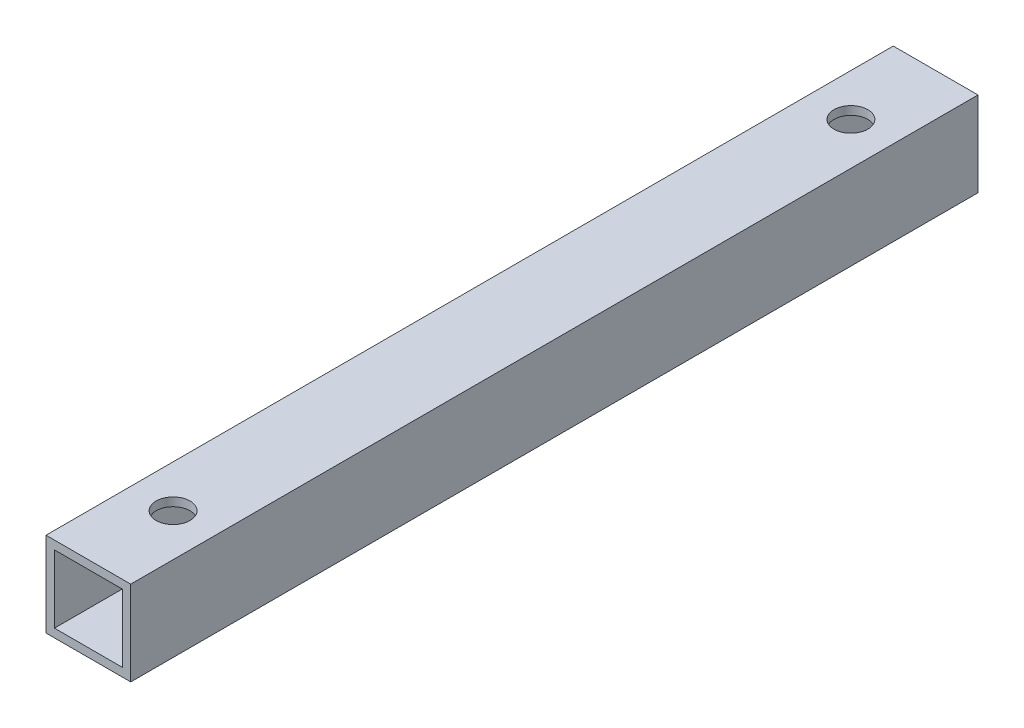
ISO-10303-21;
HEADER;
FILE_DESCRIPTION(('STEP AP214'),'2;1');
FILE_NAME('part.step','',(''),(''),'','','');
FILE_SCHEMA(('AUTOMOTIVE_DESIGN { 1 0 10303 214 1 1 1 1 }'));
ENDSEC;
DATA;
#1=APPLICATION_CONTEXT('core data for automotive mechanical design processes');
#2=APPLICATION_PROTOCOL_DEFINITION('international standard','automotive_design',2000,#1);
#3=PRODUCT_CONTEXT('',#1,'mechanical');
#4=PRODUCT('Part','Part','',(#3));
#5=PRODUCT_RELATED_PRODUCT_CATEGORY('part','',(#4));
#6=PRODUCT_DEFINITION_FORMATION('','',#4);
#7=PRODUCT_DEFINITION_CONTEXT('part definition',#1,'design');
#8=PRODUCT_DEFINITION('design','',#6,#7);
#9=PRODUCT_DEFINITION_SHAPE('','',#8);
#10=(LENGTH_UNIT() NAMED_UNIT(*) SI_UNIT(.MILLI.,.METRE.));
#11=(NAMED_UNIT(*) PLANE_ANGLE_UNIT() SI_UNIT($,.RADIAN.));
#12=(NAMED_UNIT(*) SI_UNIT($,.STERADIAN.) SOLID_ANGLE_UNIT());
#13=UNCERTAINTY_MEASURE_WITH_UNIT(LENGTH_MEASURE(1.E-05),#10,'distance_accuracy_value','');
#14=(GEOMETRIC_REPRESENTATION_CONTEXT(3) GLOBAL_UNCERTAINTY_ASSIGNED_CONTEXT((#13)) GLOBAL_UNIT_ASSIGNED_CONTEXT((#10,
#11,#12)) REPRESENTATION_CONTEXT('',''));
#15=CARTESIAN_POINT('',(0.,0.,0.));
#16=DIRECTION('',(0.,0.,1.));
#17=DIRECTION('',(1.,0.,0.));
#18=AXIS2_PLACEMENT_3D('',#15,#16,#17);
#19=CARTESIAN_POINT('',(0.,0.,100.));
#20=DIRECTION('',(0.,0.,-1.));
#21=DIRECTION('',(-1.,0.,0.));
#22=AXIS2_PLACEMENT_3D('',#19,#20,#21);
#23=PLANE('',#22);
#24=DIRECTION('',(0.,-1.,0.));
#25=VECTOR('',#24,1.);
#26=CARTESIAN_POINT('',(-0.999999999999999,-1.,100.));
#27=LINE('',#26,#25);
#28=CARTESIAN_POINT('',(-0.999999999999999,9.,100.));
#29=VERTEX_POINT('',#28);
#30=CARTESIAN_POINT('',(-0.999999999999999,-1.,100.));
#31=VERTEX_POINT('',#30);
#32=EDGE_CURVE('E140',#29,#31,#27,.T.);
#33=ORIENTED_EDGE('',*,*,#32,.T.);
#34=DIRECTION('',(1.,0.,0.));
#35=VECTOR('',#34,1.);
#36=CARTESIAN_POINT('',(9.,-1.,100.));
#37=LINE('',#36,#35);
#38=CARTESIAN_POINT('',(9.,-1.,100.));
#39=VERTEX_POINT('',#38);
#40=EDGE_CURVE('E143',#31,#39,#37,.T.);
#41=ORIENTED_EDGE('',*,*,#40,.T.);
#42=DIRECTION('',(0.,1.,0.));
#43=VECTOR('',#42,1.);
#44=CARTESIAN_POINT('',(9.,9.,100.));
#45=LINE('',#44,#43);
#46=CARTESIAN_POINT('',(9.,9.,100.));
#47=VERTEX_POINT('',#46);
#48=EDGE_CURVE('E146',#39,#47,#45,.T.);
#49=ORIENTED_EDGE('',*,*,#48,.T.);
#50=DIRECTION('',(-1.,0.,0.));
#51=VECTOR('',#50,1.);
#52=CARTESIAN_POINT('',(-0.999999999999999,9.,100.));
#53=LINE('',#52,#51);
#54=EDGE_CURVE('E148',#47,#29,#53,.T.);
#55=ORIENTED_EDGE('',*,*,#54,.T.);
#56=EDGE_LOOP('',(#33,#41,#49,#55));
#57=FACE_BOUND('',#56,.T.);
#58=DIRECTION('',(1.,0.,0.));
#59=VECTOR('',#58,1.);
#60=CARTESIAN_POINT('',(8.,0.,100.));
#61=LINE('',#60,#59);
#62=CARTESIAN_POINT('',(0.,0.,100.));
#63=VERTEX_POINT('',#62);
#64=CARTESIAN_POINT('',(8.,0.,100.));
#65=VERTEX_POINT('',#64);
#66=EDGE_CURVE('E102',#63,#65,#61,.T.);
#67=ORIENTED_EDGE('',*,*,#66,.F.);
#68=DIRECTION('',(0.,-1.,0.));
#69=VECTOR('',#68,1.);
#70=CARTESIAN_POINT('',(0.,0.,100.));
#71=LINE('',#70,#69);
#72=CARTESIAN_POINT('',(0.,8.,100.));
#73=VERTEX_POINT('',#72);
#74=EDGE_CURVE('E124',#73,#63,#71,.T.);
#75=ORIENTED_EDGE('',*,*,#74,.F.);
#76=DIRECTION('',(-1.,0.,0.));
#77=VECTOR('',#76,1.);
#78=CARTESIAN_POINT('',(0.,8.,100.));
#79=LINE('',#78,#77);
#80=CARTESIAN_POINT('',(8.,8.,100.));
#81=VERTEX_POINT('',#80);
#82=EDGE_CURVE('E122',#81,#73,#79,.T.);
#83=ORIENTED_EDGE('',*,*,#82,.F.);
#84=DIRECTION('',(0.,1.,0.));
#85=VECTOR('',#84,1.);
#86=CARTESIAN_POINT('',(8.,8.,100.));
#87=LINE('',#86,#85);
#88=EDGE_CURVE('E110',#65,#81,#87,.T.);
#89=ORIENTED_EDGE('',*,*,#88,.F.);
#90=EDGE_LOOP('',(#67,#75,#83,#89));
#91=FACE_BOUND('',#90,.T.);
#92=ADVANCED_FACE('F35',(#57,#91),#23,.F.);
#93=CARTESIAN_POINT('',(0.,0.,0.));
#94=DIRECTION('',(0.,0.,-1.));
#95=DIRECTION('',(-1.,0.,0.));
#96=AXIS2_PLACEMENT_3D('',#93,#94,#95);
#97=PLANE('',#96);
#98=DIRECTION('',(1.,0.,0.));
#99=VECTOR('',#98,1.);
#100=CARTESIAN_POINT('',(9.,-1.,0.));
#101=LINE('',#100,#99);
#102=CARTESIAN_POINT('',(-0.999999999999999,-1.,0.));
#103=VERTEX_POINT('',#102);
#104=CARTESIAN_POINT('',(9.,-1.,0.));
#105=VERTEX_POINT('',#104);
#106=EDGE_CURVE('E118',#103,#105,#101,.T.);
#107=ORIENTED_EDGE('',*,*,#106,.F.);
#108=DIRECTION('',(0.,-1.,0.));
#109=VECTOR('',#108,1.);
#110=CARTESIAN_POINT('',(-0.999999999999999,5.89679715302491,0.));
#111=LINE('',#110,#109);
#112=CARTESIAN_POINT('',(-0.999999999999999,9.,0.));
#113=VERTEX_POINT('',#112);
#114=EDGE_CURVE('E144',#113,#103,#111,.T.);
#115=ORIENTED_EDGE('',*,*,#114,.F.);
#116=DIRECTION('',(-1.,0.,0.));
#117=VECTOR('',#116,1.);
#118=CARTESIAN_POINT('',(-0.999999999999999,9.,0.));
#119=LINE('',#118,#117);
#120=CARTESIAN_POINT('',(9.,9.,0.));
#121=VERTEX_POINT('',#120);
#122=EDGE_CURVE('E155',#121,#113,#119,.T.);
#123=ORIENTED_EDGE('',*,*,#122,.F.);
#124=DIRECTION('',(0.,1.,0.));
#125=VECTOR('',#124,1.);
#126=CARTESIAN_POINT('',(9.,9.,0.));
#127=LINE('',#126,#125);
#128=EDGE_CURVE('E153',#105,#121,#127,.T.);
#129=ORIENTED_EDGE('',*,*,#128,.F.);
#130=EDGE_LOOP('',(#107,#115,#123,#129));
#131=FACE_BOUND('',#130,.T.);
#132=DIRECTION('',(0.,-1.,0.));
#133=VECTOR('',#132,1.);
#134=CARTESIAN_POINT('',(0.,0.,0.));
#135=LINE('',#134,#133);
#136=CARTESIAN_POINT('',(0.,8.,0.));
#137=VERTEX_POINT('',#136);
#138=CARTESIAN_POINT('',(0.,0.,0.));
#139=VERTEX_POINT('',#138);
#140=EDGE_CURVE('E111',#137,#139,#135,.T.);
#141=ORIENTED_EDGE('',*,*,#140,.T.);
#142=DIRECTION('',(1.,0.,0.));
#143=VECTOR('',#142,1.);
#144=CARTESIAN_POINT('',(8.,0.,0.));
#145=LINE('',#144,#143);
#146=CARTESIAN_POINT('',(8.,0.,0.));
#147=VERTEX_POINT('',#146);
#148=EDGE_CURVE('E60',#139,#147,#145,.T.);
#149=ORIENTED_EDGE('',*,*,#148,.T.);
#150=DIRECTION('',(0.,1.,0.));
#151=VECTOR('',#150,1.);
#152=CARTESIAN_POINT('',(8.,8.,0.));
#153=LINE('',#152,#151);
#154=CARTESIAN_POINT('',(8.,8.,0.));
#155=VERTEX_POINT('',#154);
#156=EDGE_CURVE('E117',#147,#155,#153,.T.);
#157=ORIENTED_EDGE('',*,*,#156,.T.);
#158=DIRECTION('',(-1.,0.,0.));
#159=VECTOR('',#158,1.);
#160=CARTESIAN_POINT('',(0.,8.,0.));
#161=LINE('',#160,#159);
#162=EDGE_CURVE('E132',#155,#137,#161,.T.);
#163=ORIENTED_EDGE('',*,*,#162,.T.);
#164=EDGE_LOOP('',(#141,#149,#157,#163));
#165=FACE_BOUND('',#164,.T.);
#166=ADVANCED_FACE('F205',(#131,#165),#97,.T.);
#167=CARTESIAN_POINT('',(9.,-1.,100.));
#168=DIRECTION('',(0.,1.,0.));
#169=DIRECTION('',(-1.,0.,0.));
#170=AXIS2_PLACEMENT_3D('',#167,#168,#169);
#171=PLANE('',#170);
#172=CARTESIAN_POINT('',(4.,-1.,90.));
#173=DIRECTION('',(0.,1.,0.));
#174=DIRECTION('',(-1.,0.,0.));
#175=AXIS2_PLACEMENT_3D('',#172,#173,#174);
#176=CIRCLE('',#175,2.);
#177=CARTESIAN_POINT('',(4.,-1.00000000000001,92.));
#178=VERTEX_POINT('',#177);
#179=EDGE_CURVE('E130',#178,#178,#176,.T.);
#180=ORIENTED_EDGE('',*,*,#179,.T.);
#181=EDGE_LOOP('',(#180));
#182=FACE_BOUND('',#181,.T.);
#183=CARTESIAN_POINT('',(4.,-1.,10.));
#184=DIRECTION('',(0.,1.,0.));
#185=DIRECTION('',(-1.,0.,0.));
#186=AXIS2_PLACEMENT_3D('',#183,#184,#185);
#187=CIRCLE('',#186,2.);
#188=CARTESIAN_POINT('',(4.,-1.00000000000001,12.));
#189=VERTEX_POINT('',#188);
#190=EDGE_CURVE('E171',#189,#189,#187,.T.);
#191=ORIENTED_EDGE('',*,*,#190,.T.);
#192=EDGE_LOOP('',(#191));
#193=FACE_BOUND('',#192,.T.);
#194=ORIENTED_EDGE('',*,*,#106,.T.);
#195=DIRECTION('',(0.,0.,-1.));
#196=VECTOR('',#195,1.);
#197=CARTESIAN_POINT('',(9.,-1.,100.));
#198=LINE('',#197,#196);
#199=EDGE_CURVE('E44',#39,#105,#198,.T.);
#200=ORIENTED_EDGE('',*,*,#199,.F.);
#201=ORIENTED_EDGE('',*,*,#40,.F.);
#202=DIRECTION('',(0.,0.,-1.));
#203=VECTOR('',#202,1.);
#204=CARTESIAN_POINT('',(-0.999999999999999,-1.,100.));
#205=LINE('',#204,#203);
#206=EDGE_CURVE('E11',#31,#103,#205,.T.);
#207=ORIENTED_EDGE('',*,*,#206,.T.);
#208=EDGE_LOOP('',(#194,#200,#201,#207));
#209=FACE_BOUND('',#208,.T.);
#210=ADVANCED_FACE('F37',(#182,#193,#209),#171,.F.);
#211=CARTESIAN_POINT('',(9.,9.,100.));
#212=DIRECTION('',(-1.,0.,0.));
#213=DIRECTION('',(0.,-1.,0.));
#214=AXIS2_PLACEMENT_3D('',#211,#212,#213);
#215=PLANE('',#214);
#216=ORIENTED_EDGE('',*,*,#128,.T.);
#217=DIRECTION('',(0.,0.,-1.));
#218=VECTOR('',#217,1.);
#219=CARTESIAN_POINT('',(9.,9.,100.));
#220=LINE('',#219,#218);
#221=EDGE_CURVE('E160',#47,#121,#220,.T.);
#222=ORIENTED_EDGE('',*,*,#221,.F.);
#223=ORIENTED_EDGE('',*,*,#48,.F.);
#224=ORIENTED_EDGE('',*,*,#199,.T.);
#225=EDGE_LOOP('',(#216,#222,#223,#224));
#226=FACE_BOUND('',#225,.T.);
#227=ADVANCED_FACE('F222',(#226),#215,.F.);
#228=CARTESIAN_POINT('',(-0.999999999999999,9.,100.));
#229=DIRECTION('',(0.,-1.,0.));
#230=DIRECTION('',(0.,0.,-1.));
#231=AXIS2_PLACEMENT_3D('',#228,#229,#230);
#232=PLANE('',#231);
#233=CARTESIAN_POINT('',(4.,9.,90.));
#234=DIRECTION('',(0.,1.,0.));
#235=DIRECTION('',(0.,0.,1.));
#236=AXIS2_PLACEMENT_3D('',#233,#234,#235);
#237=CIRCLE('',#236,2.);
#238=CARTESIAN_POINT('',(4.,8.99999999999999,92.));
#239=VERTEX_POINT('',#238);
#240=EDGE_CURVE('E167',#239,#239,#237,.T.);
#241=ORIENTED_EDGE('',*,*,#240,.F.);
#242=EDGE_LOOP('',(#241));
#243=FACE_BOUND('',#242,.T.);
#244=CARTESIAN_POINT('',(4.,9.,10.));
#245=DIRECTION('',(0.,1.,0.));
#246=DIRECTION('',(0.,0.,1.));
#247=AXIS2_PLACEMENT_3D('',#244,#245,#246);
#248=CIRCLE('',#247,2.);
#249=CARTESIAN_POINT('',(4.,8.99999999999999,12.));
#250=VERTEX_POINT('',#249);
#251=EDGE_CURVE('E174',#250,#250,#248,.T.);
#252=ORIENTED_EDGE('',*,*,#251,.F.);
#253=EDGE_LOOP('',(#252));
#254=FACE_BOUND('',#253,.T.);
#255=ORIENTED_EDGE('',*,*,#122,.T.);
#256=DIRECTION('',(0.,0.,-1.));
#257=VECTOR('',#256,1.);
#258=CARTESIAN_POINT('',(-0.999999999999999,9.,100.));
#259=LINE('',#258,#257);
#260=EDGE_CURVE('E151',#29,#113,#259,.T.);
#261=ORIENTED_EDGE('',*,*,#260,.F.);
#262=ORIENTED_EDGE('',*,*,#54,.F.);
#263=ORIENTED_EDGE('',*,*,#221,.T.);
#264=EDGE_LOOP('',(#255,#261,#262,#263));
#265=FACE_BOUND('',#264,.T.);
#266=ADVANCED_FACE('F219',(#243,#254,#265),#232,.F.);
#267=CARTESIAN_POINT('',(-0.999999999999999,5.89679715302491,100.));
#268=DIRECTION('',(1.,0.,0.));
#269=DIRECTION('',(0.,0.,-1.));
#270=AXIS2_PLACEMENT_3D('',#267,#268,#269);
#271=PLANE('',#270);
#272=ORIENTED_EDGE('',*,*,#114,.T.);
#273=ORIENTED_EDGE('',*,*,#206,.F.);
#274=ORIENTED_EDGE('',*,*,#32,.F.);
#275=ORIENTED_EDGE('',*,*,#260,.T.);
#276=EDGE_LOOP('',(#272,#273,#274,#275));
#277=FACE_BOUND('',#276,.T.);
#278=ADVANCED_FACE('F216',(#277),#271,.F.);
#279=CARTESIAN_POINT('',(8.,0.,100.));
#280=DIRECTION('',(0.,1.,0.));
#281=DIRECTION('',(0.,0.,1.));
#282=AXIS2_PLACEMENT_3D('',#279,#280,#281);
#283=PLANE('',#282);
#284=CARTESIAN_POINT('',(4.,0.,90.));
#285=DIRECTION('',(0.,1.,0.));
#286=DIRECTION('',(0.,0.,1.));
#287=AXIS2_PLACEMENT_3D('',#284,#285,#286);
#288=CIRCLE('',#287,2.);
#289=CARTESIAN_POINT('',(4.,0.,92.));
#290=VERTEX_POINT('',#289);
#291=EDGE_CURVE('E183',#290,#290,#288,.T.);
#292=ORIENTED_EDGE('',*,*,#291,.F.);
#293=EDGE_LOOP('',(#292));
#294=FACE_BOUND('',#293,.T.);
#295=CARTESIAN_POINT('',(4.,0.,10.));
#296=DIRECTION('',(0.,1.,0.));
#297=DIRECTION('',(0.,0.,1.));
#298=AXIS2_PLACEMENT_3D('',#295,#296,#297);
#299=CIRCLE('',#298,2.);
#300=CARTESIAN_POINT('',(4.,0.,12.));
#301=VERTEX_POINT('',#300);
#302=EDGE_CURVE('E166',#301,#301,#299,.T.);
#303=ORIENTED_EDGE('',*,*,#302,.F.);
#304=EDGE_LOOP('',(#303));
#305=FACE_BOUND('',#304,.T.);
#306=ORIENTED_EDGE('',*,*,#148,.F.);
#307=DIRECTION('',(0.,0.,-1.));
#308=VECTOR('',#307,1.);
#309=CARTESIAN_POINT('',(0.,0.,100.));
#310=LINE('',#309,#308);
#311=EDGE_CURVE('E106',#63,#139,#310,.T.);
#312=ORIENTED_EDGE('',*,*,#311,.F.);
#313=ORIENTED_EDGE('',*,*,#66,.T.);
#314=DIRECTION('',(0.,0.,-1.));
#315=VECTOR('',#314,1.);
#316=CARTESIAN_POINT('',(8.,0.,100.));
#317=LINE('',#316,#315);
#318=EDGE_CURVE('E105',#65,#147,#317,.T.);
#319=ORIENTED_EDGE('',*,*,#318,.T.);
#320=EDGE_LOOP('',(#306,#312,#313,#319));
#321=FACE_BOUND('',#320,.T.);
#322=ADVANCED_FACE('F104',(#294,#305,#321),#283,.T.);
#323=CARTESIAN_POINT('',(8.,8.,100.));
#324=DIRECTION('',(-1.,0.,0.));
#325=DIRECTION('',(0.,0.,1.));
#326=AXIS2_PLACEMENT_3D('',#323,#324,#325);
#327=PLANE('',#326);
#328=ORIENTED_EDGE('',*,*,#156,.F.);
#329=ORIENTED_EDGE('',*,*,#318,.F.);
#330=ORIENTED_EDGE('',*,*,#88,.T.);
#331=DIRECTION('',(0.,0.,-1.));
#332=VECTOR('',#331,1.);
#333=CARTESIAN_POINT('',(8.,8.,100.));
#334=LINE('',#333,#332);
#335=EDGE_CURVE('E119',#81,#155,#334,.T.);
#336=ORIENTED_EDGE('',*,*,#335,.T.);
#337=EDGE_LOOP('',(#328,#329,#330,#336));
#338=FACE_BOUND('',#337,.T.);
#339=ADVANCED_FACE('F114',(#338),#327,.T.);
#340=CARTESIAN_POINT('',(0.,8.,100.));
#341=DIRECTION('',(0.,-1.,0.));
#342=DIRECTION('',(0.,0.,-1.));
#343=AXIS2_PLACEMENT_3D('',#340,#341,#342);
#344=PLANE('',#343);
#345=CARTESIAN_POINT('',(4.,8.00000000000001,90.));
#346=DIRECTION('',(0.,-1.,0.));
#347=DIRECTION('',(0.,0.,-1.));
#348=AXIS2_PLACEMENT_3D('',#345,#346,#347);
#349=CIRCLE('',#348,2.);
#350=CARTESIAN_POINT('',(4.,8.00000000000002,92.));
#351=VERTEX_POINT('',#350);
#352=EDGE_CURVE('E39',#351,#351,#349,.T.);
#353=ORIENTED_EDGE('',*,*,#352,.F.);
#354=EDGE_LOOP('',(#353));
#355=FACE_BOUND('',#354,.T.);
#356=CARTESIAN_POINT('',(4.,8.00000000000001,10.));
#357=DIRECTION('',(0.,-1.,0.));
#358=DIRECTION('',(0.,0.,-1.));
#359=AXIS2_PLACEMENT_3D('',#356,#357,#358);
#360=CIRCLE('',#359,2.);
#361=CARTESIAN_POINT('',(4.,8.00000000000002,12.));
#362=VERTEX_POINT('',#361);
#363=EDGE_CURVE('E164',#362,#362,#360,.T.);
#364=ORIENTED_EDGE('',*,*,#363,.F.);
#365=EDGE_LOOP('',(#364));
#366=FACE_BOUND('',#365,.T.);
#367=ORIENTED_EDGE('',*,*,#162,.F.);
#368=ORIENTED_EDGE('',*,*,#335,.F.);
#369=ORIENTED_EDGE('',*,*,#82,.T.);
#370=DIRECTION('',(0.,0.,-1.));
#371=VECTOR('',#370,1.);
#372=CARTESIAN_POINT('',(0.,8.,100.));
#373=LINE('',#372,#371);
#374=EDGE_CURVE('E52',#73,#137,#373,.T.);
#375=ORIENTED_EDGE('',*,*,#374,.T.);
#376=EDGE_LOOP('',(#367,#368,#369,#375));
#377=FACE_BOUND('',#376,.T.);
#378=ADVANCED_FACE('F245',(#355,#366,#377),#344,.T.);
#379=CARTESIAN_POINT('',(0.,0.,100.));
#380=DIRECTION('',(1.,0.,0.));
#381=DIRECTION('',(0.,0.,-1.));
#382=AXIS2_PLACEMENT_3D('',#379,#380,#381);
#383=PLANE('',#382);
#384=ORIENTED_EDGE('',*,*,#140,.F.);
#385=ORIENTED_EDGE('',*,*,#374,.F.);
#386=ORIENTED_EDGE('',*,*,#74,.T.);
#387=ORIENTED_EDGE('',*,*,#311,.T.);
#388=EDGE_LOOP('',(#384,#385,#386,#387));
#389=FACE_BOUND('',#388,.T.);
#390=ADVANCED_FACE('F243',(#389),#383,.T.);
#391=CARTESIAN_POINT('',(4.,-95.,10.));
#392=DIRECTION('',(0.,1.,0.));
#393=DIRECTION('',(0.,0.,1.));
#394=AXIS2_PLACEMENT_3D('',#391,#392,#393);
#395=CYLINDRICAL_SURFACE('',#394,2.);
#396=CARTESIAN_POINT('',(4.,8.00000000000002,12.));
#397=CARTESIAN_POINT('',(4.,8.01041666666669,12.));
#398=CARTESIAN_POINT('',(4.,8.02083333333335,12.));
#399=CARTESIAN_POINT('',(4.,8.04166666666668,12.));
#400=CARTESIAN_POINT('',(4.,8.05208333333335,12.));
#401=CARTESIAN_POINT('',(4.,8.07291666666669,12.));
#402=CARTESIAN_POINT('',(4.,8.08333333333335,12.));
#403=CARTESIAN_POINT('',(4.,8.10416666666669,12.));
#404=CARTESIAN_POINT('',(4.,8.11458333333336,12.));
#405=CARTESIAN_POINT('',(4.,8.13541666666669,12.));
#406=CARTESIAN_POINT('',(4.,8.14583333333335,12.));
#407=CARTESIAN_POINT('',(4.,8.16666666666668,12.));
#408=CARTESIAN_POINT('',(4.,8.17708333333335,12.));
#409=CARTESIAN_POINT('',(4.,8.19791666666668,12.));
#410=CARTESIAN_POINT('',(4.,8.20833333333334,12.));
#411=CARTESIAN_POINT('',(4.,8.22916666666668,12.));
#412=CARTESIAN_POINT('',(4.,8.23958333333335,12.));
#413=CARTESIAN_POINT('',(4.,8.26041666666669,12.));
#414=CARTESIAN_POINT('',(4.,8.27083333333335,12.));
#415=CARTESIAN_POINT('',(4.,8.29166666666668,12.));
#416=CARTESIAN_POINT('',(4.,8.30208333333335,12.));
#417=CARTESIAN_POINT('',(4.,8.32291666666668,12.));
#418=CARTESIAN_POINT('',(4.,8.33333333333334,12.));
#419=CARTESIAN_POINT('',(4.,8.35416666666668,12.));
#420=CARTESIAN_POINT('',(4.,8.36458333333334,12.));
#421=CARTESIAN_POINT('',(4.,8.38541666666667,12.));
#422=CARTESIAN_POINT('',(4.,8.39583333333334,12.));
#423=CARTESIAN_POINT('',(4.,8.41666666666667,12.));
#424=CARTESIAN_POINT('',(4.,8.42708333333334,12.));
#425=CARTESIAN_POINT('',(4.,8.44791666666668,12.));
#426=CARTESIAN_POINT('',(4.,8.45833333333335,12.));
#427=CARTESIAN_POINT('',(4.,8.47916666666668,12.));
#428=CARTESIAN_POINT('',(4.,8.48958333333334,12.));
#429=CARTESIAN_POINT('',(4.,8.51041666666667,12.));
#430=CARTESIAN_POINT('',(4.,8.52083333333334,12.));
#431=CARTESIAN_POINT('',(4.,8.54166666666667,12.));
#432=CARTESIAN_POINT('',(4.,8.55208333333334,12.));
#433=CARTESIAN_POINT('',(4.,8.57291666666667,12.));
#434=CARTESIAN_POINT('',(4.,8.58333333333334,12.));
#435=CARTESIAN_POINT('',(4.,8.60416666666668,12.));
#436=CARTESIAN_POINT('',(4.,8.61458333333334,12.));
#437=CARTESIAN_POINT('',(4.,8.63541666666667,12.));
#438=CARTESIAN_POINT('',(4.,8.64583333333334,12.));
#439=CARTESIAN_POINT('',(4.,8.66666666666667,12.));
#440=CARTESIAN_POINT('',(4.,8.67708333333334,12.));
#441=CARTESIAN_POINT('',(4.,8.69791666666667,12.));
#442=CARTESIAN_POINT('',(4.,8.70833333333333,12.));
#443=CARTESIAN_POINT('',(4.,8.72916666666666,12.));
#444=CARTESIAN_POINT('',(4.,8.73958333333333,12.));
#445=CARTESIAN_POINT('',(4.,8.76041666666666,12.));
#446=CARTESIAN_POINT('',(4.,8.77083333333333,12.));
#447=CARTESIAN_POINT('',(4.,8.79166666666667,12.));
#448=CARTESIAN_POINT('',(4.,8.80208333333334,12.));
#449=CARTESIAN_POINT('',(4.,8.82291666666667,12.));
#450=CARTESIAN_POINT('',(4.,8.83333333333333,12.));
#451=CARTESIAN_POINT('',(4.,8.85416666666666,12.));
#452=CARTESIAN_POINT('',(4.,8.86458333333333,12.));
#453=CARTESIAN_POINT('',(4.,8.88541666666666,12.));
#454=CARTESIAN_POINT('',(4.,8.89583333333333,12.));
#455=CARTESIAN_POINT('',(4.,8.91666666666666,12.));
#456=CARTESIAN_POINT('',(4.,8.92708333333333,12.));
#457=CARTESIAN_POINT('',(4.,8.94791666666667,12.));
#458=CARTESIAN_POINT('',(4.,8.95833333333333,12.));
#459=CARTESIAN_POINT('',(4.,8.97916666666666,12.));
#460=CARTESIAN_POINT('',(4.,8.98958333333333,12.));
#461=CARTESIAN_POINT('',(4.,8.99999999999999,12.));
#462=B_SPLINE_CURVE_WITH_KNOTS('',3,(#396,#397,#398,#399,#400,#401,#402,#403,#404,#405,#406,
#407,#408,#409,#410,#411,#412,#413,#414,#415,#416,#417,#418,#419,#420,#421,#422,#423,#424,#425,
#426,#427,#428,#429,#430,#431,#432,#433,#434,#435,#436,#437,#438,#439,#440,#441,#442,#443,#444,
#445,#446,#447,#448,#449,#450,#451,#452,#453,#454,#455,#456,#457,#458,#459,#460,#461),
.UNSPECIFIED.,.F.,.F.,(4,2,2,2,2,2,2,2,2,2,2,2,2,2,2,2,2,2,2,2,2,2,2,2,2,2,2,2,2,2,2,2,4),(0.,
0.0312499999999966,0.0624999999999931,0.0937500000000036,0.125,0.156249999999997,
0.187499999999993,0.21874999999999,0.25,0.281249999999997,0.312499999999993,0.34374999999999,
0.374999999999986,0.406249999999983,0.437499999999993,0.46874999999999,0.499999999999987,
0.531249999999983,0.56249999999998,0.59374999999999,0.624999999999987,0.656249999999983,
0.68749999999998,0.718749999999976,0.749999999999973,0.781249999999983,0.81249999999998,
0.843749999999976,0.874999999999973,0.90624999999997,0.93749999999998,0.968749999999977,
0.999999999999973),.UNSPECIFIED.);
#463=EDGE_CURVE('BSEAM201',#362,#250,#462,.T.);
#464=ORIENTED_EDGE('',*,*,#363,.T.);
#465=ORIENTED_EDGE('',*,*,#251,.T.);
#466=ORIENTED_EDGE('',*,*,#463,.T.);
#467=ORIENTED_EDGE('',*,*,#463,.F.);
#468=EDGE_LOOP('',(#464,#466,#465,#467));
#469=FACE_BOUND('',#468,.T.);
#470=ADVANCED_FACE('F201',(#469),#395,.F.);
#471=CARTESIAN_POINT('',(4.,-95.,90.));
#472=DIRECTION('',(0.,1.,0.));
#473=DIRECTION('',(0.,0.,1.));
#474=AXIS2_PLACEMENT_3D('',#471,#472,#473);
#475=CYLINDRICAL_SURFACE('',#474,2.);
#476=CARTESIAN_POINT('',(4.,8.00000000000002,92.));
#477=CARTESIAN_POINT('',(4.,8.01041666666669,92.));
#478=CARTESIAN_POINT('',(4.,8.02083333333335,92.));
#479=CARTESIAN_POINT('',(4.,8.04166666666668,92.));
#480=CARTESIAN_POINT('',(4.,8.05208333333335,92.));
#481=CARTESIAN_POINT('',(4.,8.07291666666669,92.));
#482=CARTESIAN_POINT('',(4.,8.08333333333335,92.));
#483=CARTESIAN_POINT('',(4.,8.10416666666669,92.));
#484=CARTESIAN_POINT('',(4.,8.11458333333336,92.));
#485=CARTESIAN_POINT('',(4.,8.13541666666669,92.));
#486=CARTESIAN_POINT('',(4.,8.14583333333335,92.));
#487=CARTESIAN_POINT('',(4.,8.16666666666668,92.));
#488=CARTESIAN_POINT('',(4.,8.17708333333335,92.));
#489=CARTESIAN_POINT('',(4.,8.19791666666668,92.));
#490=CARTESIAN_POINT('',(4.,8.20833333333334,92.));
#491=CARTESIAN_POINT('',(4.,8.22916666666668,92.));
#492=CARTESIAN_POINT('',(4.,8.23958333333335,92.));
#493=CARTESIAN_POINT('',(4.,8.26041666666669,92.));
#494=CARTESIAN_POINT('',(4.,8.27083333333335,92.));
#495=CARTESIAN_POINT('',(4.,8.29166666666668,92.));
#496=CARTESIAN_POINT('',(4.,8.30208333333335,92.));
#497=CARTESIAN_POINT('',(4.,8.32291666666668,92.));
#498=CARTESIAN_POINT('',(4.,8.33333333333334,92.));
#499=CARTESIAN_POINT('',(4.,8.35416666666668,92.));
#500=CARTESIAN_POINT('',(4.,8.36458333333334,92.));
#501=CARTESIAN_POINT('',(4.,8.38541666666667,92.));
#502=CARTESIAN_POINT('',(4.,8.39583333333334,92.));
#503=CARTESIAN_POINT('',(4.,8.41666666666667,92.));
#504=CARTESIAN_POINT('',(4.,8.42708333333334,92.));
#505=CARTESIAN_POINT('',(4.,8.44791666666668,92.));
#506=CARTESIAN_POINT('',(4.,8.45833333333335,92.));
#507=CARTESIAN_POINT('',(4.,8.47916666666668,92.));
#508=CARTESIAN_POINT('',(4.,8.48958333333334,92.));
#509=CARTESIAN_POINT('',(4.,8.51041666666667,92.));
#510=CARTESIAN_POINT('',(4.,8.52083333333334,92.));
#511=CARTESIAN_POINT('',(4.,8.54166666666667,92.));
#512=CARTESIAN_POINT('',(4.,8.55208333333334,92.));
#513=CARTESIAN_POINT('',(4.,8.57291666666667,92.));
#514=CARTESIAN_POINT('',(4.,8.58333333333334,92.));
#515=CARTESIAN_POINT('',(4.,8.60416666666668,92.));
#516=CARTESIAN_POINT('',(4.,8.61458333333334,92.));
#517=CARTESIAN_POINT('',(4.,8.63541666666667,92.));
#518=CARTESIAN_POINT('',(4.,8.64583333333334,92.));
#519=CARTESIAN_POINT('',(4.,8.66666666666667,92.));
#520=CARTESIAN_POINT('',(4.,8.67708333333334,92.));
#521=CARTESIAN_POINT('',(4.,8.69791666666667,92.));
#522=CARTESIAN_POINT('',(4.,8.70833333333333,92.));
#523=CARTESIAN_POINT('',(4.,8.72916666666666,92.));
#524=CARTESIAN_POINT('',(4.,8.73958333333333,92.));
#525=CARTESIAN_POINT('',(4.,8.76041666666666,92.));
#526=CARTESIAN_POINT('',(4.,8.77083333333333,92.));
#527=CARTESIAN_POINT('',(4.,8.79166666666667,92.));
#528=CARTESIAN_POINT('',(4.,8.80208333333334,92.));
#529=CARTESIAN_POINT('',(4.,8.82291666666667,92.));
#530=CARTESIAN_POINT('',(4.,8.83333333333333,92.));
#531=CARTESIAN_POINT('',(4.,8.85416666666666,92.));
#532=CARTESIAN_POINT('',(4.,8.86458333333333,92.));
#533=CARTESIAN_POINT('',(4.,8.88541666666666,92.));
#534=CARTESIAN_POINT('',(4.,8.89583333333333,92.));
#535=CARTESIAN_POINT('',(4.,8.91666666666666,92.));
#536=CARTESIAN_POINT('',(4.,8.92708333333333,92.));
#537=CARTESIAN_POINT('',(4.,8.94791666666667,92.));
#538=CARTESIAN_POINT('',(4.,8.95833333333333,92.));
#539=CARTESIAN_POINT('',(4.,8.97916666666666,92.));
#540=CARTESIAN_POINT('',(4.,8.98958333333333,92.));
#541=CARTESIAN_POINT('',(4.,8.99999999999999,92.));
#542=B_SPLINE_CURVE_WITH_KNOTS('',3,(#476,#477,#478,#479,#480,#481,#482,#483,#484,#485,#486,
#487,#488,#489,#490,#491,#492,#493,#494,#495,#496,#497,#498,#499,#500,#501,#502,#503,#504,#505,
#506,#507,#508,#509,#510,#511,#512,#513,#514,#515,#516,#517,#518,#519,#520,#521,#522,#523,#524,
#525,#526,#527,#528,#529,#530,#531,#532,#533,#534,#535,#536,#537,#538,#539,#540,#541),
.UNSPECIFIED.,.F.,.F.,(4,2,2,2,2,2,2,2,2,2,2,2,2,2,2,2,2,2,2,2,2,2,2,2,2,2,2,2,2,2,2,2,4),(0.,
0.0312499999999966,0.0624999999999931,0.0937500000000036,0.125,0.156249999999997,
0.187499999999993,0.21874999999999,0.25,0.281249999999997,0.312499999999993,0.34374999999999,
0.374999999999986,0.406249999999983,0.437499999999993,0.46874999999999,0.499999999999987,
0.531249999999983,0.56249999999998,0.59374999999999,0.624999999999987,0.656249999999983,
0.68749999999998,0.718749999999976,0.749999999999973,0.781249999999983,0.81249999999998,
0.843749999999976,0.874999999999973,0.90624999999997,0.93749999999998,0.968749999999977,
0.999999999999973),.UNSPECIFIED.);
#543=EDGE_CURVE('BSEAM195',#351,#239,#542,.T.);
#544=ORIENTED_EDGE('',*,*,#352,.T.);
#545=ORIENTED_EDGE('',*,*,#240,.T.);
#546=ORIENTED_EDGE('',*,*,#543,.T.);
#547=ORIENTED_EDGE('',*,*,#543,.F.);
#548=EDGE_LOOP('',(#544,#546,#545,#547));
#549=FACE_BOUND('',#548,.T.);
#550=ADVANCED_FACE('F195',(#549),#475,.F.);
#551=CARTESIAN_POINT('',(4.,0.,12.));
#552=CARTESIAN_POINT('',(4.,-0.0104166666666794,12.));
#553=CARTESIAN_POINT('',(4.,-0.0208333333333449,12.));
#554=CARTESIAN_POINT('',(4.,-0.041666666666676,12.));
#555=CARTESIAN_POINT('',(4.,-0.0520833333333415,12.));
#556=CARTESIAN_POINT('',(4.,-0.0729166666666771,12.));
#557=CARTESIAN_POINT('',(4.,-0.0833333333333473,12.));
#558=CARTESIAN_POINT('',(4.,-0.104166666666683,12.));
#559=CARTESIAN_POINT('',(4.,-0.114583333333348,12.));
#560=CARTESIAN_POINT('',(4.,-0.13541666666668,12.));
#561=CARTESIAN_POINT('',(4.,-0.145833333333345,12.));
#562=CARTESIAN_POINT('',(4.,-0.166666666666681,12.));
#563=CARTESIAN_POINT('',(4.,-0.177083333333351,12.));
#564=CARTESIAN_POINT('',(4.,-0.197916666666687,12.));
#565=CARTESIAN_POINT('',(4.,-0.208333333333352,12.));
#566=CARTESIAN_POINT('',(4.,-0.229166666666683,12.));
#567=CARTESIAN_POINT('',(4.,-0.239583333333349,12.));
#568=CARTESIAN_POINT('',(4.,-0.26041666666668,12.));
#569=CARTESIAN_POINT('',(4.,-0.270833333333345,12.));
#570=CARTESIAN_POINT('',(4.,-0.291666666666676,12.));
#571=CARTESIAN_POINT('',(4.,-0.302083333333342,12.));
#572=CARTESIAN_POINT('',(4.,-0.322916666666677,12.));
#573=CARTESIAN_POINT('',(4.,-0.333333333333348,12.));
#574=CARTESIAN_POINT('',(4.,-0.354166666666683,12.));
#575=CARTESIAN_POINT('',(4.,-0.364583333333349,12.));
#576=CARTESIAN_POINT('',(4.,-0.38541666666668,12.));
#577=CARTESIAN_POINT('',(4.,-0.395833333333345,12.));
#578=CARTESIAN_POINT('',(4.,-0.416666666666681,12.));
#579=CARTESIAN_POINT('',(4.,-0.427083333333351,12.));
#580=CARTESIAN_POINT('',(4.,-0.447916666666687,12.));
#581=CARTESIAN_POINT('',(4.,-0.458333333333352,12.));
#582=CARTESIAN_POINT('',(4.,-0.479166666666683,12.));
#583=CARTESIAN_POINT('',(4.,-0.489583333333349,12.));
#584=CARTESIAN_POINT('',(4.,-0.51041666666668,12.));
#585=CARTESIAN_POINT('',(4.,-0.520833333333345,12.));
#586=CARTESIAN_POINT('',(4.,-0.541666666666676,12.));
#587=CARTESIAN_POINT('',(4.,-0.552083333333342,12.));
#588=CARTESIAN_POINT('',(4.,-0.572916666666678,12.));
#589=CARTESIAN_POINT('',(4.,-0.583333333333348,12.));
#590=CARTESIAN_POINT('',(4.,-0.604166666666683,12.));
#591=CARTESIAN_POINT('',(4.,-0.614583333333349,12.));
#592=CARTESIAN_POINT('',(4.,-0.63541666666668,12.));
#593=CARTESIAN_POINT('',(4.,-0.645833333333345,12.));
#594=CARTESIAN_POINT('',(4.,-0.666666666666681,12.));
#595=CARTESIAN_POINT('',(4.,-0.677083333333351,12.));
#596=CARTESIAN_POINT('',(4.,-0.697916666666687,12.));
#597=CARTESIAN_POINT('',(4.,-0.708333333333352,12.));
#598=CARTESIAN_POINT('',(4.,-0.729166666666684,12.));
#599=CARTESIAN_POINT('',(4.,-0.739583333333349,12.));
#600=CARTESIAN_POINT('',(4.,-0.76041666666668,12.));
#601=CARTESIAN_POINT('',(4.,-0.770833333333346,12.));
#602=CARTESIAN_POINT('',(4.,-0.791666666666677,12.));
#603=CARTESIAN_POINT('',(4.,-0.802083333333342,12.));
#604=CARTESIAN_POINT('',(4.,-0.822916666666678,12.));
#605=CARTESIAN_POINT('',(4.,-0.833333333333348,12.));
#606=CARTESIAN_POINT('',(4.,-0.854166666666684,12.));
#607=CARTESIAN_POINT('',(4.,-0.864583333333349,12.));
#608=CARTESIAN_POINT('',(4.,-0.88541666666668,12.));
#609=CARTESIAN_POINT('',(4.,-0.895833333333346,12.));
#610=CARTESIAN_POINT('',(4.,-0.916666666666681,12.));
#611=CARTESIAN_POINT('',(4.,-0.927083333333351,12.));
#612=CARTESIAN_POINT('',(4.,-0.947916666666687,12.));
#613=CARTESIAN_POINT('',(4.,-0.958333333333353,12.));
#614=CARTESIAN_POINT('',(4.,-0.979166666666684,12.));
#615=CARTESIAN_POINT('',(4.,-0.989583333333349,12.));
#616=CARTESIAN_POINT('',(4.,-1.00000000000001,12.));
#617=B_SPLINE_CURVE_WITH_KNOTS('',3,(#551,#552,#553,#554,#555,#556,#557,#558,#559,#560,#561,
#562,#563,#564,#565,#566,#567,#568,#569,#570,#571,#572,#573,#574,#575,#576,#577,#578,#579,#580,
#581,#582,#583,#584,#585,#586,#587,#588,#589,#590,#591,#592,#593,#594,#595,#596,#597,#598,#599,
#600,#601,#602,#603,#604,#605,#606,#607,#608,#609,#610,#611,#612,#613,#614,#615,#616),
.UNSPECIFIED.,.F.,.F.,(4,2,2,2,2,2,2,2,2,2,2,2,2,2,2,2,2,2,2,2,2,2,2,2,2,2,2,2,2,2,2,2,4),(0.,
0.0312499999999966,0.0624999999999931,0.0937500000000036,0.125,0.156249999999997,
0.187500000000007,0.218750000000004,0.25,0.281249999999997,0.312499999999993,0.343750000000004,
0.375,0.406249999999997,0.437500000000007,0.468750000000004,0.5,0.531249999999997,
0.562499999999994,0.593750000000004,0.625000000000001,0.656249999999997,0.687500000000008,
0.718750000000004,0.750000000000001,0.781249999999997,0.812499999999994,0.843750000000004,
0.875000000000001,0.906249999999997,0.937500000000008,0.968750000000004,1.),.UNSPECIFIED.);
#618=EDGE_CURVE('BSEAM192',#301,#189,#617,.T.);
#619=ORIENTED_EDGE('',*,*,#302,.T.);
#620=ORIENTED_EDGE('',*,*,#190,.F.);
#621=ORIENTED_EDGE('',*,*,#618,.T.);
#622=ORIENTED_EDGE('',*,*,#618,.F.);
#623=EDGE_LOOP('',(#619,#621,#620,#622));
#624=FACE_BOUND('',#623,.T.);
#625=ADVANCED_FACE('F192',(#624),#395,.F.);
#626=CARTESIAN_POINT('',(4.,0.,92.));
#627=CARTESIAN_POINT('',(4.,-0.0104166666666794,92.));
#628=CARTESIAN_POINT('',(4.,-0.0208333333333449,92.));
#629=CARTESIAN_POINT('',(4.,-0.041666666666676,92.));
#630=CARTESIAN_POINT('',(4.,-0.0520833333333415,92.));
#631=CARTESIAN_POINT('',(4.,-0.0729166666666771,92.));
#632=CARTESIAN_POINT('',(4.,-0.0833333333333473,92.));
#633=CARTESIAN_POINT('',(4.,-0.104166666666683,92.));
#634=CARTESIAN_POINT('',(4.,-0.114583333333348,92.));
#635=CARTESIAN_POINT('',(4.,-0.13541666666668,92.));
#636=CARTESIAN_POINT('',(4.,-0.145833333333345,92.));
#637=CARTESIAN_POINT('',(4.,-0.166666666666681,92.));
#638=CARTESIAN_POINT('',(4.,-0.177083333333351,92.));
#639=CARTESIAN_POINT('',(4.,-0.197916666666687,92.));
#640=CARTESIAN_POINT('',(4.,-0.208333333333352,92.));
#641=CARTESIAN_POINT('',(4.,-0.229166666666683,92.));
#642=CARTESIAN_POINT('',(4.,-0.239583333333349,92.));
#643=CARTESIAN_POINT('',(4.,-0.26041666666668,92.));
#644=CARTESIAN_POINT('',(4.,-0.270833333333345,92.));
#645=CARTESIAN_POINT('',(4.,-0.291666666666676,92.));
#646=CARTESIAN_POINT('',(4.,-0.302083333333342,92.));
#647=CARTESIAN_POINT('',(4.,-0.322916666666677,92.));
#648=CARTESIAN_POINT('',(4.,-0.333333333333348,92.));
#649=CARTESIAN_POINT('',(4.,-0.354166666666683,92.));
#650=CARTESIAN_POINT('',(4.,-0.364583333333349,92.));
#651=CARTESIAN_POINT('',(4.,-0.38541666666668,92.));
#652=CARTESIAN_POINT('',(4.,-0.395833333333345,92.));
#653=CARTESIAN_POINT('',(4.,-0.416666666666681,92.));
#654=CARTESIAN_POINT('',(4.,-0.427083333333351,92.));
#655=CARTESIAN_POINT('',(4.,-0.447916666666687,92.));
#656=CARTESIAN_POINT('',(4.,-0.458333333333352,92.));
#657=CARTESIAN_POINT('',(4.,-0.479166666666683,92.));
#658=CARTESIAN_POINT('',(4.,-0.489583333333349,92.));
#659=CARTESIAN_POINT('',(4.,-0.51041666666668,92.));
#660=CARTESIAN_POINT('',(4.,-0.520833333333345,92.));
#661=CARTESIAN_POINT('',(4.,-0.541666666666676,92.));
#662=CARTESIAN_POINT('',(4.,-0.552083333333342,92.));
#663=CARTESIAN_POINT('',(4.,-0.572916666666678,92.));
#664=CARTESIAN_POINT('',(4.,-0.583333333333348,92.));
#665=CARTESIAN_POINT('',(4.,-0.604166666666683,92.));
#666=CARTESIAN_POINT('',(4.,-0.614583333333349,92.));
#667=CARTESIAN_POINT('',(4.,-0.63541666666668,92.));
#668=CARTESIAN_POINT('',(4.,-0.645833333333345,92.));
#669=CARTESIAN_POINT('',(4.,-0.666666666666681,92.));
#670=CARTESIAN_POINT('',(4.,-0.677083333333351,92.));
#671=CARTESIAN_POINT('',(4.,-0.697916666666687,92.));
#672=CARTESIAN_POINT('',(4.,-0.708333333333352,92.));
#673=CARTESIAN_POINT('',(4.,-0.729166666666684,92.));
#674=CARTESIAN_POINT('',(4.,-0.739583333333349,92.));
#675=CARTESIAN_POINT('',(4.,-0.76041666666668,92.));
#676=CARTESIAN_POINT('',(4.,-0.770833333333346,92.));
#677=CARTESIAN_POINT('',(4.,-0.791666666666677,92.));
#678=CARTESIAN_POINT('',(4.,-0.802083333333342,92.));
#679=CARTESIAN_POINT('',(4.,-0.822916666666678,92.));
#680=CARTESIAN_POINT('',(4.,-0.833333333333348,92.));
#681=CARTESIAN_POINT('',(4.,-0.854166666666684,92.));
#682=CARTESIAN_POINT('',(4.,-0.864583333333349,92.));
#683=CARTESIAN_POINT('',(4.,-0.88541666666668,92.));
#684=CARTESIAN_POINT('',(4.,-0.895833333333346,92.));
#685=CARTESIAN_POINT('',(4.,-0.916666666666681,92.));
#686=CARTESIAN_POINT('',(4.,-0.927083333333351,92.));
#687=CARTESIAN_POINT('',(4.,-0.947916666666687,92.));
#688=CARTESIAN_POINT('',(4.,-0.958333333333353,92.));
#689=CARTESIAN_POINT('',(4.,-0.979166666666684,92.));
#690=CARTESIAN_POINT('',(4.,-0.989583333333349,92.));
#691=CARTESIAN_POINT('',(4.,-1.00000000000001,92.));
#692=B_SPLINE_CURVE_WITH_KNOTS('',3,(#626,#627,#628,#629,#630,#631,#632,#633,#634,#635,#636,
#637,#638,#639,#640,#641,#642,#643,#644,#645,#646,#647,#648,#649,#650,#651,#652,#653,#654,#655,
#656,#657,#658,#659,#660,#661,#662,#663,#664,#665,#666,#667,#668,#669,#670,#671,#672,#673,#674,
#675,#676,#677,#678,#679,#680,#681,#682,#683,#684,#685,#686,#687,#688,#689,#690,#691),
.UNSPECIFIED.,.F.,.F.,(4,2,2,2,2,2,2,2,2,2,2,2,2,2,2,2,2,2,2,2,2,2,2,2,2,2,2,2,2,2,2,2,4),(0.,
0.0312499999999966,0.0624999999999931,0.0937500000000036,0.125,0.156249999999997,
0.187500000000007,0.218750000000004,0.25,0.281249999999997,0.312499999999993,0.343750000000004,
0.375,0.406249999999997,0.437500000000007,0.468750000000004,0.5,0.531249999999997,
0.562499999999994,0.593750000000004,0.625000000000001,0.656249999999997,0.687500000000008,
0.718750000000004,0.750000000000001,0.781249999999997,0.812499999999994,0.843750000000004,
0.875000000000001,0.906249999999997,0.937500000000008,0.968750000000004,1.),.UNSPECIFIED.);
#693=EDGE_CURVE('BSEAM190',#290,#178,#692,.T.);
#694=ORIENTED_EDGE('',*,*,#291,.T.);
#695=ORIENTED_EDGE('',*,*,#179,.F.);
#696=ORIENTED_EDGE('',*,*,#693,.T.);
#697=ORIENTED_EDGE('',*,*,#693,.F.);
#698=EDGE_LOOP('',(#694,#696,#695,#697));
#699=FACE_BOUND('',#698,.T.);
#700=ADVANCED_FACE('F190',(#699),#475,.F.);
#701=CLOSED_SHELL('',(#92,#166,#210,#227,#266,#278,#322,#339,#378,#390,#470,#550,#625,#700));
#702=MANIFOLD_SOLID_BREP('B2',#701);
#703=ADVANCED_BREP_SHAPE_REPRESENTATION('',(#18,#702),#14);
#704=SHAPE_DEFINITION_REPRESENTATION(#9,#703);
ENDSEC;
END-ISO-10303-21;
